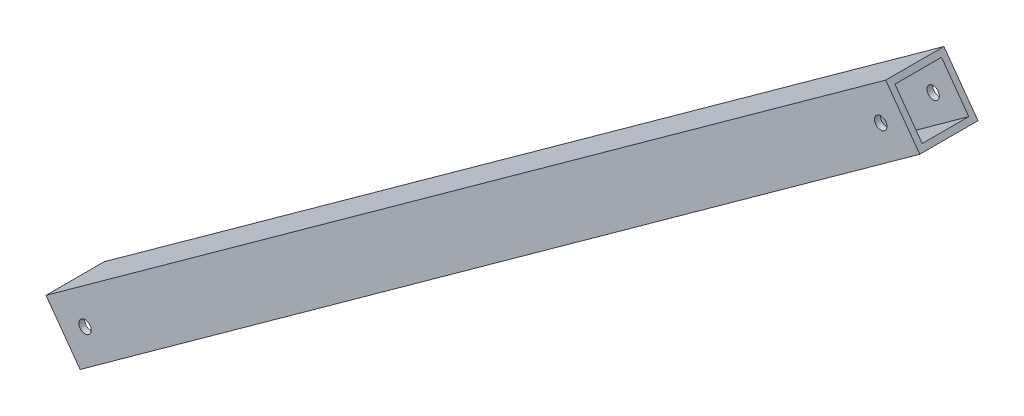
ISO-10303-21;
HEADER;
FILE_DESCRIPTION(('STEP AP214'),'2;1');
FILE_NAME('part.step','',(''),(''),'','','');
FILE_SCHEMA(('AUTOMOTIVE_DESIGN { 1 0 10303 214 1 1 1 1 }'));
ENDSEC;
DATA;
#1=APPLICATION_CONTEXT('core data for automotive mechanical design processes');
#2=APPLICATION_PROTOCOL_DEFINITION('international standard','automotive_design',2000,#1);
#3=PRODUCT_CONTEXT('',#1,'mechanical');
#4=PRODUCT('Part','Part','',(#3));
#5=PRODUCT_RELATED_PRODUCT_CATEGORY('part','',(#4));
#6=PRODUCT_DEFINITION_FORMATION('','',#4);
#7=PRODUCT_DEFINITION_CONTEXT('part definition',#1,'design');
#8=PRODUCT_DEFINITION('design','',#6,#7);
#9=PRODUCT_DEFINITION_SHAPE('','',#8);
#10=(LENGTH_UNIT() NAMED_UNIT(*) SI_UNIT(.MILLI.,.METRE.));
#11=(NAMED_UNIT(*) PLANE_ANGLE_UNIT() SI_UNIT($,.RADIAN.));
#12=(NAMED_UNIT(*) SI_UNIT($,.STERADIAN.) SOLID_ANGLE_UNIT());
#13=UNCERTAINTY_MEASURE_WITH_UNIT(LENGTH_MEASURE(1.E-05),#10,'distance_accuracy_value','');
#14=(GEOMETRIC_REPRESENTATION_CONTEXT(3) GLOBAL_UNCERTAINTY_ASSIGNED_CONTEXT((#13)) GLOBAL_UNIT_ASSIGNED_CONTEXT((#10,
#11,#12)) REPRESENTATION_CONTEXT('',''));
#15=CARTESIAN_POINT('',(0.,0.,0.));
#16=DIRECTION('',(0.,0.,1.));
#17=DIRECTION('',(1.,0.,0.));
#18=AXIS2_PLACEMENT_3D('',#15,#16,#17);
#19=CARTESIAN_POINT('',(205.,148.,15.));
#20=DIRECTION('',(0.,0.,-1.));
#21=DIRECTION('',(-1.,0.,0.));
#22=AXIS2_PLACEMENT_3D('',#19,#20,#21);
#23=CYLINDRICAL_SURFACE('',#22,1.59999999999999);
#24=CARTESIAN_POINT('',(205.,148.,13.5));
#25=DIRECTION('',(0.,0.,1.));
#26=DIRECTION('',(1.,0.,0.));
#27=AXIS2_PLACEMENT_3D('',#24,#25,#26);
#28=CIRCLE('',#27,1.59999999999999);
#29=CARTESIAN_POINT('',(206.6,148.,13.5));
#30=VERTEX_POINT('',#29);
#31=EDGE_CURVE('E156',#30,#30,#28,.T.);
#32=ORIENTED_EDGE('',*,*,#31,.F.);
#33=EDGE_LOOP('',(#32));
#34=FACE_BOUND('',#33,.T.);
#35=CARTESIAN_POINT('',(205.,148.,15.));
#36=DIRECTION('',(0.,0.,1.));
#37=DIRECTION('',(1.,0.,0.));
#38=AXIS2_PLACEMENT_3D('',#35,#36,#37);
#39=CIRCLE('',#38,1.59999999999999);
#40=CARTESIAN_POINT('',(206.6,148.,15.));
#41=VERTEX_POINT('',#40);
#42=EDGE_CURVE('E179',#41,#41,#39,.T.);
#43=ORIENTED_EDGE('',*,*,#42,.T.);
#44=EDGE_LOOP('',(#43));
#45=FACE_BOUND('',#44,.T.);
#46=ADVANCED_FACE('F45',(#34,#45),#23,.F.);
#47=CARTESIAN_POINT('',(0.,0.,15.));
#48=DIRECTION('',(0.,0.,-1.));
#49=DIRECTION('',(-1.,0.,0.));
#50=AXIS2_PLACEMENT_3D('',#47,#48,#49);
#51=CYLINDRICAL_SURFACE('',#50,1.6);
#52=CARTESIAN_POINT('',(0.,0.,13.5));
#53=DIRECTION('',(0.,0.,1.));
#54=DIRECTION('',(1.,0.,0.));
#55=AXIS2_PLACEMENT_3D('',#52,#53,#54);
#56=CIRCLE('',#55,1.6);
#57=CARTESIAN_POINT('',(1.6,0.,13.5));
#58=VERTEX_POINT('',#57);
#59=EDGE_CURVE('E49',#58,#58,#56,.T.);
#60=ORIENTED_EDGE('',*,*,#59,.F.);
#61=EDGE_LOOP('',(#60));
#62=FACE_BOUND('',#61,.T.);
#63=CARTESIAN_POINT('',(0.,0.,15.));
#64=DIRECTION('',(0.,0.,1.));
#65=DIRECTION('',(1.,0.,0.));
#66=AXIS2_PLACEMENT_3D('',#63,#64,#65);
#67=CIRCLE('',#66,1.6);
#68=CARTESIAN_POINT('',(1.6,0.,15.));
#69=VERTEX_POINT('',#68);
#70=EDGE_CURVE('E171',#69,#69,#67,.T.);
#71=ORIENTED_EDGE('',*,*,#70,.T.);
#72=EDGE_LOOP('',(#71));
#73=FACE_BOUND('',#72,.T.);
#74=ADVANCED_FACE('F233',(#62,#73),#51,.F.);
#75=CARTESIAN_POINT('',(0.,0.,15.));
#76=DIRECTION('',(0.,0.,-1.));
#77=DIRECTION('',(-1.,0.,0.));
#78=AXIS2_PLACEMENT_3D('',#75,#76,#77);
#79=PLANE('',#78);
#80=DIRECTION('',(-0.810783506693965,-0.585346141418082,0.));
#81=VECTOR('',#80,1.);
#82=CARTESIAN_POINT('',(-10.0655806074933,1.98345331027805,15.));
#83=LINE('',#82,#81);
#84=CARTESIAN_POINT('',(206.285388486222,158.178299290131,15.));
#85=VERTEX_POINT('',#84);
#86=CARTESIAN_POINT('',(-10.0655806074933,1.98345331027805,15.));
#87=VERTEX_POINT('',#86);
#88=EDGE_CURVE('E187',#85,#87,#83,.T.);
#89=ORIENTED_EDGE('',*,*,#88,.T.);
#90=DIRECTION('',(0.585346141418082,-0.810783506693965,0.));
#91=VECTOR('',#90,1.);
#92=CARTESIAN_POINT('',(-10.0655806074933,1.98345331027805,15.));
#93=LINE('',#92,#91);
#94=CARTESIAN_POINT('',(-1.28538848622205,-10.1782992901314,15.));
#95=VERTEX_POINT('',#94);
#96=EDGE_CURVE('E191',#87,#95,#93,.T.);
#97=ORIENTED_EDGE('',*,*,#96,.T.);
#98=DIRECTION('',(0.810783506693965,0.585346141418083,0.));
#99=VECTOR('',#98,1.);
#100=CARTESIAN_POINT('',(-1.28538848622205,-10.1782992901314,15.));
#101=LINE('',#100,#99);
#102=CARTESIAN_POINT('',(215.065580607493,146.016546689722,15.));
#103=VERTEX_POINT('',#102);
#104=EDGE_CURVE('E195',#95,#103,#101,.T.);
#105=ORIENTED_EDGE('',*,*,#104,.T.);
#106=DIRECTION('',(-0.585346141418082,0.810783506693965,0.));
#107=VECTOR('',#106,1.);
#108=CARTESIAN_POINT('',(206.285388486222,158.178299290131,15.));
#109=LINE('',#108,#107);
#110=EDGE_CURVE('E198',#103,#85,#109,.T.);
#111=ORIENTED_EDGE('',*,*,#110,.T.);
#112=EDGE_LOOP('',(#89,#97,#105,#111));
#113=FACE_BOUND('',#112,.T.);
#114=ORIENTED_EDGE('',*,*,#42,.F.);
#115=EDGE_LOOP('',(#114));
#116=FACE_BOUND('',#115,.T.);
#117=ORIENTED_EDGE('',*,*,#70,.F.);
#118=EDGE_LOOP('',(#117));
#119=FACE_BOUND('',#118,.T.);
#120=ADVANCED_FACE('F238',(#113,#116,#119),#79,.F.);
#121=CARTESIAN_POINT('',(0.,0.,0.));
#122=DIRECTION('',(0.,0.,-1.));
#123=DIRECTION('',(-1.,0.,0.));
#124=AXIS2_PLACEMENT_3D('',#121,#122,#123);
#125=PLANE('',#124);
#126=CARTESIAN_POINT('',(205.,148.,0.));
#127=DIRECTION('',(0.,0.,1.));
#128=DIRECTION('',(1.,0.,0.));
#129=AXIS2_PLACEMENT_3D('',#126,#127,#128);
#130=CIRCLE('',#129,1.59999999999999);
#131=CARTESIAN_POINT('',(206.6,148.,0.));
#132=VERTEX_POINT('',#131);
#133=EDGE_CURVE('E175',#132,#132,#130,.T.);
#134=ORIENTED_EDGE('',*,*,#133,.T.);
#135=EDGE_LOOP('',(#134));
#136=FACE_BOUND('',#135,.T.);
#137=DIRECTION('',(-0.810783506693965,-0.585346141418082,0.));
#138=VECTOR('',#137,1.);
#139=CARTESIAN_POINT('',(-10.0655806074933,1.98345331027805,0.));
#140=LINE('',#139,#138);
#141=CARTESIAN_POINT('',(206.285388486222,158.178299290131,0.));
#142=VERTEX_POINT('',#141);
#143=CARTESIAN_POINT('',(-10.0655806074933,1.98345331027805,0.));
#144=VERTEX_POINT('',#143);
#145=EDGE_CURVE('E183',#142,#144,#140,.T.);
#146=ORIENTED_EDGE('',*,*,#145,.F.);
#147=DIRECTION('',(-0.585346141418082,0.810783506693965,0.));
#148=VECTOR('',#147,1.);
#149=CARTESIAN_POINT('',(206.285388486222,158.178299290131,0.));
#150=LINE('',#149,#148);
#151=CARTESIAN_POINT('',(215.065580607493,146.016546689722,0.));
#152=VERTEX_POINT('',#151);
#153=EDGE_CURVE('E192',#152,#142,#150,.T.);
#154=ORIENTED_EDGE('',*,*,#153,.F.);
#155=DIRECTION('',(0.810783506693965,0.585346141418083,0.));
#156=VECTOR('',#155,1.);
#157=CARTESIAN_POINT('',(-1.28538848622205,-10.1782992901314,0.));
#158=LINE('',#157,#156);
#159=CARTESIAN_POINT('',(-1.28538848622205,-10.1782992901314,0.));
#160=VERTEX_POINT('',#159);
#161=EDGE_CURVE('E208',#160,#152,#158,.T.);
#162=ORIENTED_EDGE('',*,*,#161,.F.);
#163=DIRECTION('',(0.585346141418082,-0.810783506693965,0.));
#164=VECTOR('',#163,1.);
#165=CARTESIAN_POINT('',(-10.0655806074933,1.98345331027805,0.));
#166=LINE('',#165,#164);
#167=EDGE_CURVE('E205',#144,#160,#166,.T.);
#168=ORIENTED_EDGE('',*,*,#167,.F.);
#169=EDGE_LOOP('',(#146,#154,#162,#168));
#170=FACE_BOUND('',#169,.T.);
#171=CARTESIAN_POINT('',(0.,0.,0.));
#172=DIRECTION('',(0.,0.,1.));
#173=DIRECTION('',(1.,0.,0.));
#174=AXIS2_PLACEMENT_3D('',#171,#172,#173);
#175=CIRCLE('',#174,1.6);
#176=CARTESIAN_POINT('',(1.6,0.,0.));
#177=VERTEX_POINT('',#176);
#178=EDGE_CURVE('E170',#177,#177,#175,.T.);
#179=ORIENTED_EDGE('',*,*,#178,.T.);
#180=EDGE_LOOP('',(#179));
#181=FACE_BOUND('',#180,.T.);
#182=ADVANCED_FACE('F236',(#136,#170,#181),#125,.T.);
#183=CARTESIAN_POINT('',(-10.0655806074933,1.98345331027805,15.));
#184=DIRECTION('',(0.585346141418082,-0.810783506693965,0.));
#185=DIRECTION('',(0.810783506693965,0.585346141418082,0.));
#186=AXIS2_PLACEMENT_3D('',#183,#184,#185);
#187=PLANE('',#186);
#188=ORIENTED_EDGE('',*,*,#145,.T.);
#189=DIRECTION('',(0.,0.,-1.));
#190=VECTOR('',#189,1.);
#191=CARTESIAN_POINT('',(-10.0655806074933,1.98345331027805,15.));
#192=LINE('',#191,#190);
#193=EDGE_CURVE('E11',#87,#144,#192,.T.);
#194=ORIENTED_EDGE('',*,*,#193,.F.);
#195=ORIENTED_EDGE('',*,*,#88,.F.);
#196=DIRECTION('',(0.,0.,-1.));
#197=VECTOR('',#196,1.);
#198=CARTESIAN_POINT('',(206.285388486222,158.178299290131,15.));
#199=LINE('',#198,#197);
#200=EDGE_CURVE('E201',#85,#142,#199,.T.);
#201=ORIENTED_EDGE('',*,*,#200,.T.);
#202=EDGE_LOOP('',(#188,#194,#195,#201));
#203=FACE_BOUND('',#202,.T.);
#204=ADVANCED_FACE('F47',(#203),#187,.F.);
#205=CARTESIAN_POINT('',(-10.0655806074933,1.98345331027805,15.));
#206=DIRECTION('',(0.810783506693965,0.585346141418082,0.));
#207=DIRECTION('',(-0.585346141418082,0.810783506693965,0.));
#208=AXIS2_PLACEMENT_3D('',#205,#206,#207);
#209=PLANE('',#208);
#210=DIRECTION('',(0.585346141418082,-0.810783506693965,0.));
#211=VECTOR('',#210,1.);
#212=CARTESIAN_POINT('',(-10.0655806074933,1.98345331027805,13.5));
#213=LINE('',#212,#211);
#214=CARTESIAN_POINT('',(-9.18756139536614,0.767278050237062,13.5));
#215=VERTEX_POINT('',#214);
#216=CARTESIAN_POINT('',(-2.16340769834924,-8.9621240300904,13.5));
#217=VERTEX_POINT('',#216);
#218=EDGE_CURVE('E160',#215,#217,#213,.T.);
#219=ORIENTED_EDGE('',*,*,#218,.T.);
#220=DIRECTION('',(0.,0.,-1.));
#221=VECTOR('',#220,1.);
#222=CARTESIAN_POINT('',(-2.16340769834924,-8.9621240300904,15.));
#223=LINE('',#222,#221);
#224=CARTESIAN_POINT('',(-2.16340769834924,-8.9621240300904,1.5));
#225=VERTEX_POINT('',#224);
#226=EDGE_CURVE('E166',#217,#225,#223,.T.);
#227=ORIENTED_EDGE('',*,*,#226,.T.);
#228=DIRECTION('',(-0.585346141418082,0.810783506693965,0.));
#229=VECTOR('',#228,1.);
#230=CARTESIAN_POINT('',(-10.0655806074933,1.98345331027805,1.5));
#231=LINE('',#230,#229);
#232=CARTESIAN_POINT('',(-9.18756139536614,0.76727805023706,1.5));
#233=VERTEX_POINT('',#232);
#234=EDGE_CURVE('E153',#225,#233,#231,.T.);
#235=ORIENTED_EDGE('',*,*,#234,.T.);
#236=DIRECTION('',(0.,0.,1.));
#237=VECTOR('',#236,1.);
#238=CARTESIAN_POINT('',(-9.18756139536614,0.767278050237061,15.));
#239=LINE('',#238,#237);
#240=EDGE_CURVE('E119',#233,#215,#239,.T.);
#241=ORIENTED_EDGE('',*,*,#240,.T.);
#242=EDGE_LOOP('',(#219,#227,#235,#241));
#243=FACE_BOUND('',#242,.T.);
#244=ORIENTED_EDGE('',*,*,#167,.T.);
#245=DIRECTION('',(0.,0.,-1.));
#246=VECTOR('',#245,1.);
#247=CARTESIAN_POINT('',(-1.28538848622205,-10.1782992901314,15.));
#248=LINE('',#247,#246);
#249=EDGE_CURVE('E55',#95,#160,#248,.T.);
#250=ORIENTED_EDGE('',*,*,#249,.F.);
#251=ORIENTED_EDGE('',*,*,#96,.F.);
#252=ORIENTED_EDGE('',*,*,#193,.T.);
#253=EDGE_LOOP('',(#244,#250,#251,#252));
#254=FACE_BOUND('',#253,.T.);
#255=ADVANCED_FACE('F245',(#243,#254),#209,.F.);
#256=CARTESIAN_POINT('',(-1.28538848622205,-10.1782992901314,15.));
#257=DIRECTION('',(-0.585346141418083,0.810783506693964,0.));
#258=DIRECTION('',(-0.810783506693965,-0.585346141418083,0.));
#259=AXIS2_PLACEMENT_3D('',#256,#257,#258);
#260=PLANE('',#259);
#261=ORIENTED_EDGE('',*,*,#161,.T.);
#262=DIRECTION('',(0.,0.,-1.));
#263=VECTOR('',#262,1.);
#264=CARTESIAN_POINT('',(215.065580607493,146.016546689722,15.));
#265=LINE('',#264,#263);
#266=EDGE_CURVE('E216',#103,#152,#265,.T.);
#267=ORIENTED_EDGE('',*,*,#266,.F.);
#268=ORIENTED_EDGE('',*,*,#104,.F.);
#269=ORIENTED_EDGE('',*,*,#249,.T.);
#270=EDGE_LOOP('',(#261,#267,#268,#269));
#271=FACE_BOUND('',#270,.T.);
#272=ADVANCED_FACE('F266',(#271),#260,.F.);
#273=CARTESIAN_POINT('',(206.285388486222,158.178299290131,15.));
#274=DIRECTION('',(-0.810783506693965,-0.585346141418082,0.));
#275=DIRECTION('',(0.585346141418082,-0.810783506693965,0.));
#276=AXIS2_PLACEMENT_3D('',#273,#274,#275);
#277=PLANE('',#276);
#278=DIRECTION('',(-0.585346141418082,0.810783506693965,0.));
#279=VECTOR('',#278,1.);
#280=CARTESIAN_POINT('',(214.187561395366,147.232721949763,1.5));
#281=LINE('',#280,#279);
#282=CARTESIAN_POINT('',(214.187561395366,147.232721949763,1.5));
#283=VERTEX_POINT('',#282);
#284=CARTESIAN_POINT('',(207.163407698349,156.96212403009,1.5));
#285=VERTEX_POINT('',#284);
#286=EDGE_CURVE('E126',#283,#285,#281,.T.);
#287=ORIENTED_EDGE('',*,*,#286,.F.);
#288=DIRECTION('',(0.,0.,-1.));
#289=VECTOR('',#288,1.);
#290=CARTESIAN_POINT('',(214.187561395366,147.232721949763,13.5));
#291=LINE('',#290,#289);
#292=CARTESIAN_POINT('',(214.187561395366,147.232721949763,13.5));
#293=VERTEX_POINT('',#292);
#294=EDGE_CURVE('E71',#293,#283,#291,.T.);
#295=ORIENTED_EDGE('',*,*,#294,.F.);
#296=DIRECTION('',(0.585346141418082,-0.810783506693965,0.));
#297=VECTOR('',#296,1.);
#298=CARTESIAN_POINT('',(207.163407698349,156.96212403009,13.5));
#299=LINE('',#298,#297);
#300=CARTESIAN_POINT('',(207.163407698349,156.96212403009,13.5));
#301=VERTEX_POINT('',#300);
#302=EDGE_CURVE('E134',#301,#293,#299,.T.);
#303=ORIENTED_EDGE('',*,*,#302,.F.);
#304=DIRECTION('',(0.,0.,1.));
#305=VECTOR('',#304,1.);
#306=CARTESIAN_POINT('',(207.163407698349,156.96212403009,1.5));
#307=LINE('',#306,#305);
#308=EDGE_CURVE('E116',#285,#301,#307,.T.);
#309=ORIENTED_EDGE('',*,*,#308,.F.);
#310=EDGE_LOOP('',(#287,#295,#303,#309));
#311=FACE_BOUND('',#310,.T.);
#312=ORIENTED_EDGE('',*,*,#153,.T.);
#313=ORIENTED_EDGE('',*,*,#200,.F.);
#314=ORIENTED_EDGE('',*,*,#110,.F.);
#315=ORIENTED_EDGE('',*,*,#266,.T.);
#316=EDGE_LOOP('',(#312,#313,#314,#315));
#317=FACE_BOUND('',#316,.T.);
#318=ADVANCED_FACE('F131',(#311,#317),#277,.F.);
#319=CARTESIAN_POINT('',(205.,148.,1.5));
#320=DIRECTION('',(0.,0.,-1.));
#321=DIRECTION('',(-1.,0.,0.));
#322=AXIS2_PLACEMENT_3D('',#319,#320,#321);
#323=CIRCLE('',#322,1.59999999999999);
#324=CARTESIAN_POINT('',(203.4,148.,1.5));
#325=VERTEX_POINT('',#324);
#326=EDGE_CURVE('E149',#325,#325,#323,.T.);
#327=ORIENTED_EDGE('',*,*,#326,.F.);
#328=EDGE_LOOP('',(#327));
#329=FACE_BOUND('',#328,.T.);
#330=ORIENTED_EDGE('',*,*,#133,.F.);
#331=EDGE_LOOP('',(#330));
#332=FACE_BOUND('',#331,.T.);
#333=ADVANCED_FACE('F231',(#329,#332),#23,.F.);
#334=CARTESIAN_POINT('',(0.,0.,1.5));
#335=DIRECTION('',(0.,0.,-1.));
#336=DIRECTION('',(-1.,0.,0.));
#337=AXIS2_PLACEMENT_3D('',#334,#335,#336);
#338=CIRCLE('',#337,1.6);
#339=CARTESIAN_POINT('',(-1.6,0.,1.5));
#340=VERTEX_POINT('',#339);
#341=EDGE_CURVE('E144',#340,#340,#338,.T.);
#342=ORIENTED_EDGE('',*,*,#341,.F.);
#343=EDGE_LOOP('',(#342));
#344=FACE_BOUND('',#343,.T.);
#345=ORIENTED_EDGE('',*,*,#178,.F.);
#346=EDGE_LOOP('',(#345));
#347=FACE_BOUND('',#346,.T.);
#348=ADVANCED_FACE('F227',(#344,#347),#51,.F.);
#349=CARTESIAN_POINT('',(-7.93524166879186,-13.1291066038734,13.5));
#350=DIRECTION('',(0.585346141418082,-0.810783506693965,0.));
#351=DIRECTION('',(0.810783506693965,0.585346141418082,0.));
#352=AXIS2_PLACEMENT_3D('',#349,#350,#351);
#353=PLANE('',#352);
#354=DIRECTION('',(0.810783506693965,0.585346141418082,0.));
#355=VECTOR('',#354,1.);
#356=CARTESIAN_POINT('',(-7.93524166879186,-13.1291066038734,13.5));
#357=LINE('',#356,#355);
#358=EDGE_CURVE('E141',#217,#293,#357,.T.);
#359=ORIENTED_EDGE('',*,*,#358,.T.);
#360=ORIENTED_EDGE('',*,*,#294,.T.);
#361=DIRECTION('',(0.810783506693965,0.585346141418082,0.));
#362=VECTOR('',#361,1.);
#363=CARTESIAN_POINT('',(-7.93524166879186,-13.1291066038734,1.5));
#364=LINE('',#363,#362);
#365=EDGE_CURVE('E123',#225,#283,#364,.T.);
#366=ORIENTED_EDGE('',*,*,#365,.F.);
#367=ORIENTED_EDGE('',*,*,#226,.F.);
#368=EDGE_LOOP('',(#359,#360,#366,#367));
#369=FACE_BOUND('',#368,.T.);
#370=ADVANCED_FACE('F230',(#369),#353,.F.);
#371=CARTESIAN_POINT('',(-14.9593953658088,-3.3997045235459,1.5));
#372=DIRECTION('',(-0.585346141418082,0.810783506693965,0.));
#373=DIRECTION('',(-0.810783506693965,-0.585346141418082,0.));
#374=AXIS2_PLACEMENT_3D('',#371,#372,#373);
#375=PLANE('',#374);
#376=DIRECTION('',(0.810783506693965,0.585346141418082,0.));
#377=VECTOR('',#376,1.);
#378=CARTESIAN_POINT('',(-14.9593953658088,-3.3997045235459,1.5));
#379=LINE('',#378,#377);
#380=EDGE_CURVE('E63',#233,#285,#379,.T.);
#381=ORIENTED_EDGE('',*,*,#380,.T.);
#382=ORIENTED_EDGE('',*,*,#308,.T.);
#383=DIRECTION('',(0.810783506693965,0.585346141418082,0.));
#384=VECTOR('',#383,1.);
#385=CARTESIAN_POINT('',(-14.9593953658088,-3.3997045235459,13.5));
#386=LINE('',#385,#384);
#387=EDGE_CURVE('E122',#215,#301,#386,.T.);
#388=ORIENTED_EDGE('',*,*,#387,.F.);
#389=ORIENTED_EDGE('',*,*,#240,.F.);
#390=EDGE_LOOP('',(#381,#382,#388,#389));
#391=FACE_BOUND('',#390,.T.);
#392=ADVANCED_FACE('F113',(#391),#375,.F.);
#393=CARTESIAN_POINT('',(-14.9593953658088,-3.3997045235459,13.5));
#394=DIRECTION('',(0.,0.,1.));
#395=DIRECTION('',(1.,0.,0.));
#396=AXIS2_PLACEMENT_3D('',#393,#394,#395);
#397=PLANE('',#396);
#398=ORIENTED_EDGE('',*,*,#31,.T.);
#399=EDGE_LOOP('',(#398));
#400=FACE_BOUND('',#399,.T.);
#401=ORIENTED_EDGE('',*,*,#59,.T.);
#402=EDGE_LOOP('',(#401));
#403=FACE_BOUND('',#402,.T.);
#404=ORIENTED_EDGE('',*,*,#387,.T.);
#405=ORIENTED_EDGE('',*,*,#302,.T.);
#406=ORIENTED_EDGE('',*,*,#358,.F.);
#407=ORIENTED_EDGE('',*,*,#218,.F.);
#408=EDGE_LOOP('',(#404,#405,#406,#407));
#409=FACE_BOUND('',#408,.T.);
#410=ADVANCED_FACE('F272',(#400,#403,#409),#397,.F.);
#411=CARTESIAN_POINT('',(-7.93524166879186,-13.1291066038734,1.5));
#412=DIRECTION('',(0.,0.,-1.));
#413=DIRECTION('',(-1.,0.,0.));
#414=AXIS2_PLACEMENT_3D('',#411,#412,#413);
#415=PLANE('',#414);
#416=ORIENTED_EDGE('',*,*,#326,.T.);
#417=EDGE_LOOP('',(#416));
#418=FACE_BOUND('',#417,.T.);
#419=ORIENTED_EDGE('',*,*,#341,.T.);
#420=EDGE_LOOP('',(#419));
#421=FACE_BOUND('',#420,.T.);
#422=ORIENTED_EDGE('',*,*,#365,.T.);
#423=ORIENTED_EDGE('',*,*,#286,.T.);
#424=ORIENTED_EDGE('',*,*,#380,.F.);
#425=ORIENTED_EDGE('',*,*,#234,.F.);
#426=EDGE_LOOP('',(#422,#423,#424,#425));
#427=FACE_BOUND('',#426,.T.);
#428=ADVANCED_FACE('F127',(#418,#421,#427),#415,.F.);
#429=CLOSED_SHELL('',(#46,#74,#120,#182,#204,#255,#272,#318,#333,#348,#370,#392,#410,#428));
#430=MANIFOLD_SOLID_BREP('B2',#429);
#431=ADVANCED_BREP_SHAPE_REPRESENTATION('',(#18,#430),#14);
#432=SHAPE_DEFINITION_REPRESENTATION(#9,#431);
ENDSEC;
END-ISO-10303-21;
